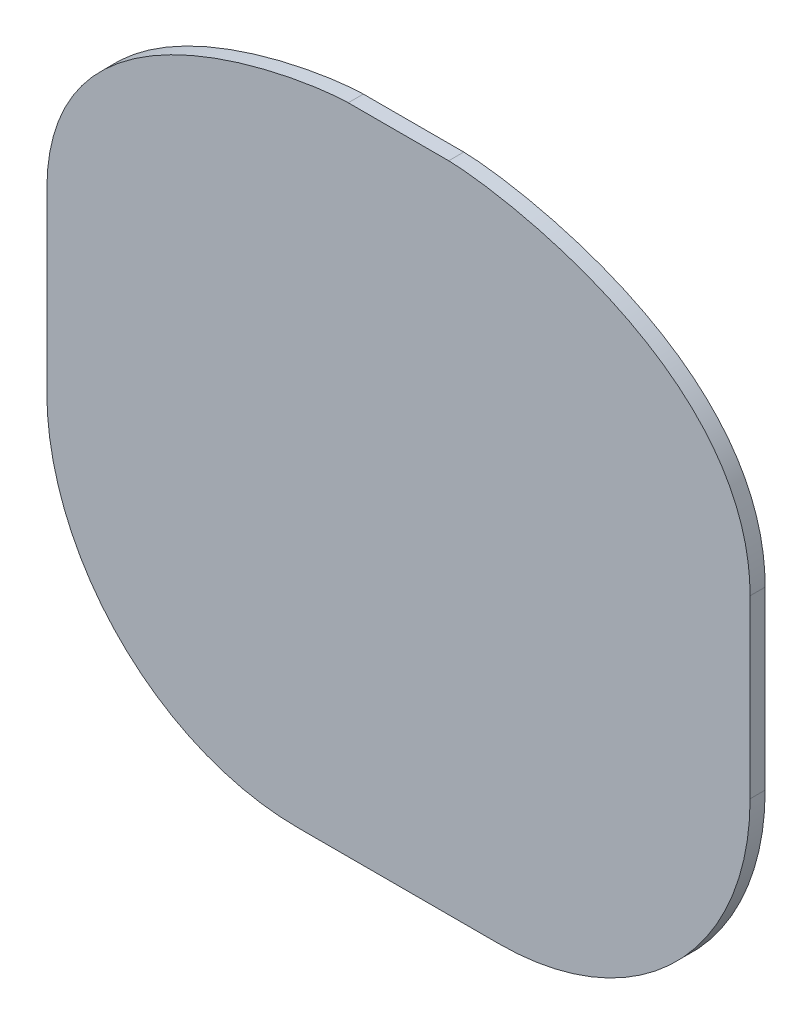
ISO-10303-21;
HEADER;
FILE_DESCRIPTION(('STEP AP214'),'2;1');
FILE_NAME('part.step','',(''),(''),'','','');
FILE_SCHEMA(('AUTOMOTIVE_DESIGN { 1 0 10303 214 1 1 1 1 }'));
ENDSEC;
DATA;
#1=APPLICATION_CONTEXT('core data for automotive mechanical design processes');
#2=APPLICATION_PROTOCOL_DEFINITION('international standard','automotive_design',2000,#1);
#3=PRODUCT_CONTEXT('',#1,'mechanical');
#4=PRODUCT('Part','Part','',(#3));
#5=PRODUCT_RELATED_PRODUCT_CATEGORY('part','',(#4));
#6=PRODUCT_DEFINITION_FORMATION('','',#4);
#7=PRODUCT_DEFINITION_CONTEXT('part definition',#1,'design');
#8=PRODUCT_DEFINITION('design','',#6,#7);
#9=PRODUCT_DEFINITION_SHAPE('','',#8);
#10=(LENGTH_UNIT() NAMED_UNIT(*) SI_UNIT(.MILLI.,.METRE.));
#11=(NAMED_UNIT(*) PLANE_ANGLE_UNIT() SI_UNIT($,.RADIAN.));
#12=(NAMED_UNIT(*) SI_UNIT($,.STERADIAN.) SOLID_ANGLE_UNIT());
#13=UNCERTAINTY_MEASURE_WITH_UNIT(LENGTH_MEASURE(1.E-05),#10,'distance_accuracy_value','');
#14=(GEOMETRIC_REPRESENTATION_CONTEXT(3) GLOBAL_UNCERTAINTY_ASSIGNED_CONTEXT((#13)) GLOBAL_UNIT_ASSIGNED_CONTEXT((#10,
#11,#12)) REPRESENTATION_CONTEXT('',''));
#15=CARTESIAN_POINT('',(0.,0.,0.));
#16=DIRECTION('',(0.,0.,1.));
#17=DIRECTION('',(1.,0.,0.));
#18=AXIS2_PLACEMENT_3D('',#15,#16,#17);
#19=CARTESIAN_POINT('',(9.99999999999999,33.5,3.));
#20=CARTESIAN_POINT('',(18.,33.5,3.));
#21=CARTESIAN_POINT('',(70.,26.5,3.));
#22=CARTESIAN_POINT('',(70.,-11.5,3.));
#23=B_SPLINE_CURVE_WITH_KNOTS('',3,(#19,#20,#21,#22),.UNSPECIFIED.,.F.,.F.,(4,4),(0.,1.),.UNSPECIFIED.);
#24=DIRECTION('',(0.,0.,-1.));
#25=VECTOR('',#24,1.);
#26=SURFACE_OF_LINEAR_EXTRUSION('',#23,#25);
#27=CARTESIAN_POINT('',(9.99999999999999,33.5,0.));
#28=CARTESIAN_POINT('',(18.,33.5,0.));
#29=CARTESIAN_POINT('',(70.,26.5,0.));
#30=CARTESIAN_POINT('',(70.,-11.5,0.));
#31=B_SPLINE_CURVE_WITH_KNOTS('',3,(#27,#28,#29,#30),.UNSPECIFIED.,.F.,.F.,(4,4),(0.,1.),.UNSPECIFIED.);
#32=CARTESIAN_POINT('',(9.99999999999999,33.5,0.));
#33=VERTEX_POINT('',#32);
#34=CARTESIAN_POINT('',(70.,-11.5,0.));
#35=VERTEX_POINT('',#34);
#36=EDGE_CURVE('E133',#33,#35,#31,.T.);
#37=ORIENTED_EDGE('',*,*,#36,.F.);
#38=DIRECTION('',(0.,0.,-1.));
#39=VECTOR('',#38,1.);
#40=CARTESIAN_POINT('',(9.99999999999999,33.5,3.));
#41=LINE('',#40,#39);
#42=CARTESIAN_POINT('',(9.99999999999999,33.5,3.));
#43=VERTEX_POINT('',#42);
#44=EDGE_CURVE('E11',#43,#33,#41,.T.);
#45=ORIENTED_EDGE('',*,*,#44,.F.);
#46=CARTESIAN_POINT('',(70.,-11.5,3.));
#47=VERTEX_POINT('',#46);
#48=EDGE_CURVE('E161',#43,#47,#23,.T.);
#49=ORIENTED_EDGE('',*,*,#48,.T.);
#50=DIRECTION('',(0.,0.,-1.));
#51=VECTOR('',#50,1.);
#52=CARTESIAN_POINT('',(70.,-11.5,3.));
#53=LINE('',#52,#51);
#54=EDGE_CURVE('E56',#47,#35,#53,.T.);
#55=ORIENTED_EDGE('',*,*,#54,.T.);
#56=EDGE_LOOP('',(#37,#45,#49,#55));
#57=FACE_BOUND('',#56,.T.);
#58=ADVANCED_FACE('F39',(#57),#26,.T.);
#59=CARTESIAN_POINT('',(0.,33.5,3.));
#60=DIRECTION('',(0.,1.,0.));
#61=DIRECTION('',(-1.,0.,0.));
#62=AXIS2_PLACEMENT_3D('',#59,#60,#61);
#63=PLANE('',#62);
#64=DIRECTION('',(1.,0.,0.));
#65=VECTOR('',#64,1.);
#66=CARTESIAN_POINT('',(0.,33.5,0.));
#67=LINE('',#66,#65);
#68=CARTESIAN_POINT('',(-10.,33.5,0.));
#69=VERTEX_POINT('',#68);
#70=EDGE_CURVE('E137',#69,#33,#67,.T.);
#71=ORIENTED_EDGE('',*,*,#70,.F.);
#72=DIRECTION('',(0.,0.,-1.));
#73=VECTOR('',#72,1.);
#74=CARTESIAN_POINT('',(-10.,33.5,3.));
#75=LINE('',#74,#73);
#76=CARTESIAN_POINT('',(-10.,33.5,3.));
#77=VERTEX_POINT('',#76);
#78=EDGE_CURVE('E48',#77,#69,#75,.T.);
#79=ORIENTED_EDGE('',*,*,#78,.F.);
#80=DIRECTION('',(1.,0.,0.));
#81=VECTOR('',#80,1.);
#82=CARTESIAN_POINT('',(0.,33.5,3.));
#83=LINE('',#82,#81);
#84=EDGE_CURVE('E197',#77,#43,#83,.T.);
#85=ORIENTED_EDGE('',*,*,#84,.T.);
#86=ORIENTED_EDGE('',*,*,#44,.T.);
#87=EDGE_LOOP('',(#71,#79,#85,#86));
#88=FACE_BOUND('',#87,.T.);
#89=ADVANCED_FACE('F179',(#88),#63,.T.);
#90=CARTESIAN_POINT('',(-70.,-11.5,3.));
#91=CARTESIAN_POINT('',(-70.,26.5,3.));
#92=CARTESIAN_POINT('',(-18.,33.5,3.));
#93=CARTESIAN_POINT('',(-10.,33.5,3.));
#94=B_SPLINE_CURVE_WITH_KNOTS('',3,(#90,#91,#92,#93),.UNSPECIFIED.,.F.,.F.,(4,4),(0.,1.),.UNSPECIFIED.);
#95=DIRECTION('',(0.,0.,-1.));
#96=VECTOR('',#95,1.);
#97=SURFACE_OF_LINEAR_EXTRUSION('',#94,#96);
#98=CARTESIAN_POINT('',(-70.,-11.5,0.));
#99=CARTESIAN_POINT('',(-70.,26.5,0.));
#100=CARTESIAN_POINT('',(-18.,33.5,0.));
#101=CARTESIAN_POINT('',(-10.,33.5,0.));
#102=B_SPLINE_CURVE_WITH_KNOTS('',3,(#98,#99,#100,#101),.UNSPECIFIED.,.F.,.F.,(4,4),(0.,1.),.UNSPECIFIED.);
#103=CARTESIAN_POINT('',(-70.,-11.5,0.));
#104=VERTEX_POINT('',#103);
#105=EDGE_CURVE('E143',#104,#69,#102,.T.);
#106=ORIENTED_EDGE('',*,*,#105,.F.);
#107=DIRECTION('',(0.,0.,-1.));
#108=VECTOR('',#107,1.);
#109=CARTESIAN_POINT('',(-70.,-11.5,3.));
#110=LINE('',#109,#108);
#111=CARTESIAN_POINT('',(-70.,-11.5,3.));
#112=VERTEX_POINT('',#111);
#113=EDGE_CURVE('E168',#112,#104,#110,.T.);
#114=ORIENTED_EDGE('',*,*,#113,.F.);
#115=EDGE_CURVE('E175',#112,#77,#94,.T.);
#116=ORIENTED_EDGE('',*,*,#115,.T.);
#117=ORIENTED_EDGE('',*,*,#78,.T.);
#118=EDGE_LOOP('',(#106,#114,#116,#117));
#119=FACE_BOUND('',#118,.T.);
#120=ADVANCED_FACE('F173',(#119),#97,.T.);
#121=CARTESIAN_POINT('',(-70.,0.,3.));
#122=DIRECTION('',(1.,0.,0.));
#123=DIRECTION('',(0.,1.,0.));
#124=AXIS2_PLACEMENT_3D('',#121,#122,#123);
#125=PLANE('',#124);
#126=DIRECTION('',(0.,-1.,0.));
#127=VECTOR('',#126,1.);
#128=CARTESIAN_POINT('',(-70.,0.,0.));
#129=LINE('',#128,#127);
#130=CARTESIAN_POINT('',(-70.,-46.5,0.));
#131=VERTEX_POINT('',#130);
#132=EDGE_CURVE('E148',#104,#131,#129,.T.);
#133=ORIENTED_EDGE('',*,*,#132,.T.);
#134=DIRECTION('',(0.,0.,-1.));
#135=VECTOR('',#134,1.);
#136=CARTESIAN_POINT('',(-70.,-46.5,3.));
#137=LINE('',#136,#135);
#138=CARTESIAN_POINT('',(-70.,-46.5,3.));
#139=VERTEX_POINT('',#138);
#140=EDGE_CURVE('E165',#139,#131,#137,.T.);
#141=ORIENTED_EDGE('',*,*,#140,.F.);
#142=DIRECTION('',(0.,-1.,0.));
#143=VECTOR('',#142,1.);
#144=CARTESIAN_POINT('',(-70.,0.,3.));
#145=LINE('',#144,#143);
#146=EDGE_CURVE('E190',#112,#139,#145,.T.);
#147=ORIENTED_EDGE('',*,*,#146,.F.);
#148=ORIENTED_EDGE('',*,*,#113,.T.);
#149=EDGE_LOOP('',(#133,#141,#147,#148));
#150=FACE_BOUND('',#149,.T.);
#151=ADVANCED_FACE('F186',(#150),#125,.F.);
#152=CARTESIAN_POINT('',(-20.,-46.5,3.));
#153=DIRECTION('',(0.,0.,-1.));
#154=DIRECTION('',(-1.,0.,0.));
#155=AXIS2_PLACEMENT_3D('',#152,#153,#154);
#156=CYLINDRICAL_SURFACE('',#155,50.);
#157=CARTESIAN_POINT('',(-20.,-46.5,0.));
#158=DIRECTION('',(0.,0.,1.));
#159=DIRECTION('',(1.,0.,0.));
#160=AXIS2_PLACEMENT_3D('',#157,#158,#159);
#161=CIRCLE('',#160,50.);
#162=CARTESIAN_POINT('',(-20.,-96.5,0.));
#163=VERTEX_POINT('',#162);
#164=EDGE_CURVE('E153',#131,#163,#161,.T.);
#165=ORIENTED_EDGE('',*,*,#164,.T.);
#166=DIRECTION('',(0.,0.,-1.));
#167=VECTOR('',#166,1.);
#168=CARTESIAN_POINT('',(-20.,-96.5,3.));
#169=LINE('',#168,#167);
#170=CARTESIAN_POINT('',(-20.,-96.5,3.));
#171=VERTEX_POINT('',#170);
#172=EDGE_CURVE('E125',#171,#163,#169,.T.);
#173=ORIENTED_EDGE('',*,*,#172,.F.);
#174=CARTESIAN_POINT('',(-20.,-46.5,3.));
#175=DIRECTION('',(0.,0.,1.));
#176=DIRECTION('',(1.,0.,0.));
#177=AXIS2_PLACEMENT_3D('',#174,#175,#176);
#178=CIRCLE('',#177,50.);
#179=EDGE_CURVE('E113',#139,#171,#178,.T.);
#180=ORIENTED_EDGE('',*,*,#179,.F.);
#181=ORIENTED_EDGE('',*,*,#140,.T.);
#182=EDGE_LOOP('',(#165,#173,#180,#181));
#183=FACE_BOUND('',#182,.T.);
#184=ADVANCED_FACE('F189',(#183),#156,.T.);
#185=CARTESIAN_POINT('',(0.,-96.5,3.));
#186=DIRECTION('',(0.,1.,0.));
#187=DIRECTION('',(0.,0.,1.));
#188=AXIS2_PLACEMENT_3D('',#185,#186,#187);
#189=PLANE('',#188);
#190=DIRECTION('',(1.,0.,0.));
#191=VECTOR('',#190,1.);
#192=CARTESIAN_POINT('',(0.,-96.5,0.));
#193=LINE('',#192,#191);
#194=CARTESIAN_POINT('',(20.,-96.5,0.));
#195=VERTEX_POINT('',#194);
#196=EDGE_CURVE('E122',#163,#195,#193,.T.);
#197=ORIENTED_EDGE('',*,*,#196,.T.);
#198=DIRECTION('',(0.,0.,-1.));
#199=VECTOR('',#198,1.);
#200=CARTESIAN_POINT('',(20.,-96.5,3.));
#201=LINE('',#200,#199);
#202=CARTESIAN_POINT('',(20.,-96.5,3.));
#203=VERTEX_POINT('',#202);
#204=EDGE_CURVE('E119',#203,#195,#201,.T.);
#205=ORIENTED_EDGE('',*,*,#204,.F.);
#206=DIRECTION('',(1.,0.,0.));
#207=VECTOR('',#206,1.);
#208=CARTESIAN_POINT('',(0.,-96.5,3.));
#209=LINE('',#208,#207);
#210=EDGE_CURVE('E106',#171,#203,#209,.T.);
#211=ORIENTED_EDGE('',*,*,#210,.F.);
#212=ORIENTED_EDGE('',*,*,#172,.T.);
#213=EDGE_LOOP('',(#197,#205,#211,#212));
#214=FACE_BOUND('',#213,.T.);
#215=ADVANCED_FACE('F120',(#214),#189,.F.);
#216=CARTESIAN_POINT('',(20.,-46.5,3.));
#217=DIRECTION('',(0.,0.,-1.));
#218=DIRECTION('',(-1.,0.,0.));
#219=AXIS2_PLACEMENT_3D('',#216,#217,#218);
#220=CYLINDRICAL_SURFACE('',#219,50.);
#221=CARTESIAN_POINT('',(20.,-46.5,0.));
#222=DIRECTION('',(0.,0.,1.));
#223=DIRECTION('',(1.,0.,0.));
#224=AXIS2_PLACEMENT_3D('',#221,#222,#223);
#225=CIRCLE('',#224,50.);
#226=CARTESIAN_POINT('',(70.,-46.5,0.));
#227=VERTEX_POINT('',#226);
#228=EDGE_CURVE('E156',#195,#227,#225,.T.);
#229=ORIENTED_EDGE('',*,*,#228,.T.);
#230=DIRECTION('',(0.,0.,-1.));
#231=VECTOR('',#230,1.);
#232=CARTESIAN_POINT('',(70.,-46.5,3.));
#233=LINE('',#232,#231);
#234=CARTESIAN_POINT('',(70.,-46.5,3.));
#235=VERTEX_POINT('',#234);
#236=EDGE_CURVE('E82',#235,#227,#233,.T.);
#237=ORIENTED_EDGE('',*,*,#236,.F.);
#238=CARTESIAN_POINT('',(20.,-46.5,3.));
#239=DIRECTION('',(0.,0.,1.));
#240=DIRECTION('',(1.,0.,0.));
#241=AXIS2_PLACEMENT_3D('',#238,#239,#240);
#242=CIRCLE('',#241,50.);
#243=EDGE_CURVE('E111',#203,#235,#242,.T.);
#244=ORIENTED_EDGE('',*,*,#243,.F.);
#245=ORIENTED_EDGE('',*,*,#204,.T.);
#246=EDGE_LOOP('',(#229,#237,#244,#245));
#247=FACE_BOUND('',#246,.T.);
#248=ADVANCED_FACE('F127',(#247),#220,.T.);
#249=CARTESIAN_POINT('',(70.,0.,3.));
#250=DIRECTION('',(1.,0.,0.));
#251=DIRECTION('',(0.,1.,0.));
#252=AXIS2_PLACEMENT_3D('',#249,#250,#251);
#253=PLANE('',#252);
#254=DIRECTION('',(0.,-1.,0.));
#255=VECTOR('',#254,1.);
#256=CARTESIAN_POINT('',(70.,0.,0.));
#257=LINE('',#256,#255);
#258=EDGE_CURVE('E158',#35,#227,#257,.T.);
#259=ORIENTED_EDGE('',*,*,#258,.F.);
#260=ORIENTED_EDGE('',*,*,#54,.F.);
#261=DIRECTION('',(0.,-1.,0.));
#262=VECTOR('',#261,1.);
#263=CARTESIAN_POINT('',(70.,0.,3.));
#264=LINE('',#263,#262);
#265=EDGE_CURVE('E128',#47,#235,#264,.T.);
#266=ORIENTED_EDGE('',*,*,#265,.T.);
#267=ORIENTED_EDGE('',*,*,#236,.T.);
#268=EDGE_LOOP('',(#259,#260,#266,#267));
#269=FACE_BOUND('',#268,.T.);
#270=ADVANCED_FACE('F211',(#269),#253,.T.);
#271=CARTESIAN_POINT('',(0.,0.,3.));
#272=DIRECTION('',(0.,0.,1.));
#273=DIRECTION('',(1.,0.,0.));
#274=AXIS2_PLACEMENT_3D('',#271,#272,#273);
#275=PLANE('',#274);
#276=ORIENTED_EDGE('',*,*,#48,.F.);
#277=ORIENTED_EDGE('',*,*,#84,.F.);
#278=ORIENTED_EDGE('',*,*,#115,.F.);
#279=ORIENTED_EDGE('',*,*,#146,.T.);
#280=ORIENTED_EDGE('',*,*,#179,.T.);
#281=ORIENTED_EDGE('',*,*,#210,.T.);
#282=ORIENTED_EDGE('',*,*,#243,.T.);
#283=ORIENTED_EDGE('',*,*,#265,.F.);
#284=EDGE_LOOP('',(#276,#277,#278,#279,#280,#281,#282,#283));
#285=FACE_BOUND('',#284,.T.);
#286=ADVANCED_FACE('F108',(#285),#275,.T.);
#287=CARTESIAN_POINT('',(0.,0.,0.));
#288=DIRECTION('',(0.,0.,1.));
#289=DIRECTION('',(1.,0.,0.));
#290=AXIS2_PLACEMENT_3D('',#287,#288,#289);
#291=PLANE('',#290);
#292=ORIENTED_EDGE('',*,*,#36,.T.);
#293=ORIENTED_EDGE('',*,*,#258,.T.);
#294=ORIENTED_EDGE('',*,*,#228,.F.);
#295=ORIENTED_EDGE('',*,*,#196,.F.);
#296=ORIENTED_EDGE('',*,*,#164,.F.);
#297=ORIENTED_EDGE('',*,*,#132,.F.);
#298=ORIENTED_EDGE('',*,*,#105,.T.);
#299=ORIENTED_EDGE('',*,*,#70,.T.);
#300=EDGE_LOOP('',(#292,#293,#294,#295,#296,#297,#298,#299));
#301=FACE_BOUND('',#300,.T.);
#302=ADVANCED_FACE('F182',(#301),#291,.F.);
#303=CLOSED_SHELL('',(#58,#89,#120,#151,#184,#215,#248,#270,#286,#302));
#304=MANIFOLD_SOLID_BREP('B2',#303);
#305=ADVANCED_BREP_SHAPE_REPRESENTATION('',(#18,#304),#14);
#306=SHAPE_DEFINITION_REPRESENTATION(#9,#305);
ENDSEC;
END-ISO-10303-21;
